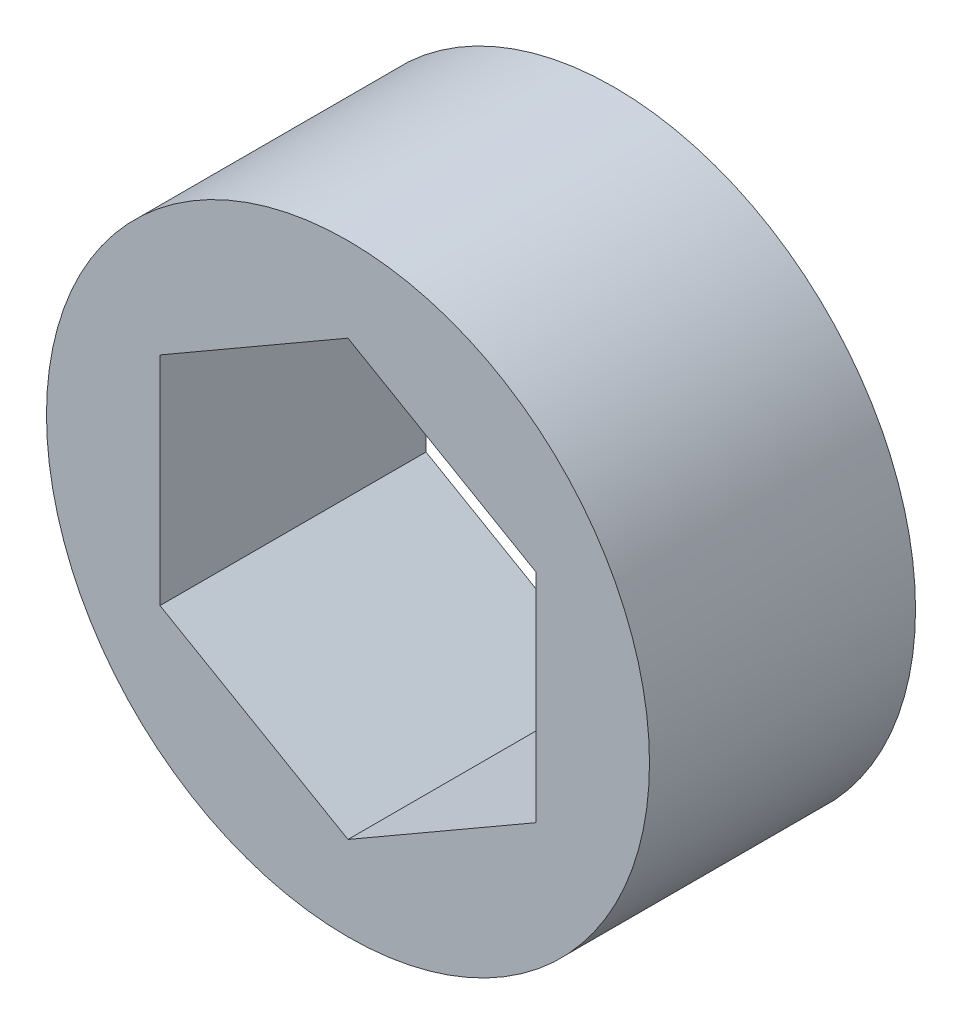
ISO-10303-21;
HEADER;
FILE_DESCRIPTION(('STEP AP214'),'2;1');
FILE_NAME('part.step','',(''),(''),'','','');
FILE_SCHEMA(('AUTOMOTIVE_DESIGN { 1 0 10303 214 1 1 1 1 }'));
ENDSEC;
DATA;
#1=APPLICATION_CONTEXT('core data for automotive mechanical design processes');
#2=APPLICATION_PROTOCOL_DEFINITION('international standard','automotive_design',2000,#1);
#3=PRODUCT_CONTEXT('',#1,'mechanical');
#4=PRODUCT('Part','Part','',(#3));
#5=PRODUCT_RELATED_PRODUCT_CATEGORY('part','',(#4));
#6=PRODUCT_DEFINITION_FORMATION('','',#4);
#7=PRODUCT_DEFINITION_CONTEXT('part definition',#1,'design');
#8=PRODUCT_DEFINITION('design','',#6,#7);
#9=PRODUCT_DEFINITION_SHAPE('','',#8);
#10=(LENGTH_UNIT() NAMED_UNIT(*) SI_UNIT(.MILLI.,.METRE.));
#11=(NAMED_UNIT(*) PLANE_ANGLE_UNIT() SI_UNIT($,.RADIAN.));
#12=(NAMED_UNIT(*) SI_UNIT($,.STERADIAN.) SOLID_ANGLE_UNIT());
#13=UNCERTAINTY_MEASURE_WITH_UNIT(LENGTH_MEASURE(1.E-05),#10,'distance_accuracy_value','');
#14=(GEOMETRIC_REPRESENTATION_CONTEXT(3) GLOBAL_UNCERTAINTY_ASSIGNED_CONTEXT((#13)) GLOBAL_UNIT_ASSIGNED_CONTEXT((#10,
#11,#12)) REPRESENTATION_CONTEXT('',''));
#15=CARTESIAN_POINT('',(0.,0.,0.));
#16=DIRECTION('',(0.,0.,1.));
#17=DIRECTION('',(1.,0.,0.));
#18=AXIS2_PLACEMENT_3D('',#15,#16,#17);
#19=CARTESIAN_POINT('',(0.,0.,9.525));
#20=DIRECTION('',(0.,0.,1.));
#21=DIRECTION('',(1.,0.,0.));
#22=AXIS2_PLACEMENT_3D('',#19,#20,#21);
#23=PLANE('',#22);
#24=CARTESIAN_POINT('',(0.,0.,9.525));
#25=DIRECTION('',(0.,0.,1.));
#26=DIRECTION('',(1.,0.,0.));
#27=AXIS2_PLACEMENT_3D('',#24,#25,#26);
#28=CIRCLE('',#27,10.795);
#29=CARTESIAN_POINT('',(10.795,0.,9.525));
#30=VERTEX_POINT('',#29);
#31=EDGE_CURVE('E11',#30,#30,#28,.T.);
#32=ORIENTED_EDGE('',*,*,#31,.T.);
#33=EDGE_LOOP('',(#32));
#34=FACE_BOUND('',#33,.T.);
#35=DIRECTION('',(-0.866025403784439,0.5,0.));
#36=VECTOR('',#35,1.);
#37=CARTESIAN_POINT('',(6.731,3.88614466191537,9.525));
#38=LINE('',#37,#36);
#39=CARTESIAN_POINT('',(6.731,3.88614466191537,9.525));
#40=VERTEX_POINT('',#39);
#41=CARTESIAN_POINT('',(0.,7.77228932383074,9.525));
#42=VERTEX_POINT('',#41);
#43=EDGE_CURVE('E99',#40,#42,#38,.T.);
#44=ORIENTED_EDGE('',*,*,#43,.F.);
#45=DIRECTION('',(0.,1.,0.));
#46=VECTOR('',#45,1.);
#47=CARTESIAN_POINT('',(6.731,-3.88614466191537,9.525));
#48=LINE('',#47,#46);
#49=CARTESIAN_POINT('',(6.731,-3.88614466191537,9.525));
#50=VERTEX_POINT('',#49);
#51=EDGE_CURVE('E91',#50,#40,#48,.T.);
#52=ORIENTED_EDGE('',*,*,#51,.F.);
#53=DIRECTION('',(0.866025403784439,0.5,0.));
#54=VECTOR('',#53,1.);
#55=CARTESIAN_POINT('',(0.,-7.77228932383074,9.525));
#56=LINE('',#55,#54);
#57=CARTESIAN_POINT('',(0.,-7.77228932383074,9.525));
#58=VERTEX_POINT('',#57);
#59=EDGE_CURVE('E119',#58,#50,#56,.T.);
#60=ORIENTED_EDGE('',*,*,#59,.F.);
#61=DIRECTION('',(0.866025403784439,-0.5,0.));
#62=VECTOR('',#61,1.);
#63=CARTESIAN_POINT('',(-6.731,-3.88614466191537,9.525));
#64=LINE('',#63,#62);
#65=CARTESIAN_POINT('',(-6.731,-3.88614466191537,9.525));
#66=VERTEX_POINT('',#65);
#67=EDGE_CURVE('E117',#66,#58,#64,.T.);
#68=ORIENTED_EDGE('',*,*,#67,.F.);
#69=DIRECTION('',(0.,-1.,0.));
#70=VECTOR('',#69,1.);
#71=CARTESIAN_POINT('',(-6.731,3.88614466191537,9.525));
#72=LINE('',#71,#70);
#73=CARTESIAN_POINT('',(-6.731,3.88614466191537,9.525));
#74=VERTEX_POINT('',#73);
#75=EDGE_CURVE('E113',#74,#66,#72,.T.);
#76=ORIENTED_EDGE('',*,*,#75,.F.);
#77=DIRECTION('',(-0.866025403784439,-0.5,0.));
#78=VECTOR('',#77,1.);
#79=CARTESIAN_POINT('',(0.,7.77228932383074,9.525));
#80=LINE('',#79,#78);
#81=EDGE_CURVE('E111',#42,#74,#80,.T.);
#82=ORIENTED_EDGE('',*,*,#81,.F.);
#83=EDGE_LOOP('',(#44,#52,#60,#68,#76,#82));
#84=FACE_BOUND('',#83,.T.);
#85=ADVANCED_FACE('F38',(#34,#84),#23,.T.);
#86=CARTESIAN_POINT('',(0.,0.,0.));
#87=DIRECTION('',(0.,0.,1.));
#88=DIRECTION('',(1.,0.,0.));
#89=AXIS2_PLACEMENT_3D('',#86,#87,#88);
#90=PLANE('',#89);
#91=CARTESIAN_POINT('',(0.,0.,0.));
#92=DIRECTION('',(0.,0.,1.));
#93=DIRECTION('',(1.,0.,0.));
#94=AXIS2_PLACEMENT_3D('',#91,#92,#93);
#95=CIRCLE('',#94,10.795);
#96=CARTESIAN_POINT('',(10.795,0.,0.));
#97=VERTEX_POINT('',#96);
#98=EDGE_CURVE('E42',#97,#97,#95,.T.);
#99=ORIENTED_EDGE('',*,*,#98,.F.);
#100=EDGE_LOOP('',(#99));
#101=FACE_BOUND('',#100,.T.);
#102=DIRECTION('',(0.,1.,0.));
#103=VECTOR('',#102,1.);
#104=CARTESIAN_POINT('',(6.731,-3.88614466191537,0.));
#105=LINE('',#104,#103);
#106=CARTESIAN_POINT('',(6.731,-3.88614466191537,0.));
#107=VERTEX_POINT('',#106);
#108=CARTESIAN_POINT('',(6.731,3.88614466191537,0.));
#109=VERTEX_POINT('',#108);
#110=EDGE_CURVE('E61',#107,#109,#105,.T.);
#111=ORIENTED_EDGE('',*,*,#110,.T.);
#112=DIRECTION('',(-0.866025403784439,0.5,0.));
#113=VECTOR('',#112,1.);
#114=CARTESIAN_POINT('',(6.731,3.88614466191537,0.));
#115=LINE('',#114,#113);
#116=CARTESIAN_POINT('',(0.,7.77228932383074,0.));
#117=VERTEX_POINT('',#116);
#118=EDGE_CURVE('E106',#109,#117,#115,.T.);
#119=ORIENTED_EDGE('',*,*,#118,.T.);
#120=DIRECTION('',(-0.866025403784439,-0.5,0.));
#121=VECTOR('',#120,1.);
#122=CARTESIAN_POINT('',(0.,7.77228932383074,0.));
#123=LINE('',#122,#121);
#124=CARTESIAN_POINT('',(-6.731,3.88614466191537,0.));
#125=VERTEX_POINT('',#124);
#126=EDGE_CURVE('E123',#117,#125,#123,.T.);
#127=ORIENTED_EDGE('',*,*,#126,.T.);
#128=DIRECTION('',(0.,-1.,0.));
#129=VECTOR('',#128,1.);
#130=CARTESIAN_POINT('',(-6.731,3.88614466191537,0.));
#131=LINE('',#130,#129);
#132=CARTESIAN_POINT('',(-6.731,-3.88614466191537,0.));
#133=VERTEX_POINT('',#132);
#134=EDGE_CURVE('E126',#125,#133,#131,.T.);
#135=ORIENTED_EDGE('',*,*,#134,.T.);
#136=DIRECTION('',(0.866025403784439,-0.5,0.));
#137=VECTOR('',#136,1.);
#138=CARTESIAN_POINT('',(-6.731,-3.88614466191537,0.));
#139=LINE('',#138,#137);
#140=CARTESIAN_POINT('',(0.,-7.77228932383074,0.));
#141=VERTEX_POINT('',#140);
#142=EDGE_CURVE('E129',#133,#141,#139,.T.);
#143=ORIENTED_EDGE('',*,*,#142,.T.);
#144=DIRECTION('',(0.866025403784439,0.5,0.));
#145=VECTOR('',#144,1.);
#146=CARTESIAN_POINT('',(0.,-7.77228932383074,0.));
#147=LINE('',#146,#145);
#148=EDGE_CURVE('E100',#141,#107,#147,.T.);
#149=ORIENTED_EDGE('',*,*,#148,.T.);
#150=EDGE_LOOP('',(#111,#119,#127,#135,#143,#149));
#151=FACE_BOUND('',#150,.T.);
#152=ADVANCED_FACE('F146',(#101,#151),#90,.F.);
#153=CARTESIAN_POINT('',(0.,0.,9.525));
#154=DIRECTION('',(0.,0.,-1.));
#155=DIRECTION('',(-1.,0.,0.));
#156=AXIS2_PLACEMENT_3D('',#153,#154,#155);
#157=CYLINDRICAL_SURFACE('',#156,10.795);
#158=ORIENTED_EDGE('',*,*,#31,.F.);
#159=EDGE_LOOP('',(#158));
#160=FACE_BOUND('',#159,.T.);
#161=ORIENTED_EDGE('',*,*,#98,.T.);
#162=EDGE_LOOP('',(#161));
#163=FACE_BOUND('',#162,.T.);
#164=ADVANCED_FACE('F40',(#160,#163),#157,.T.);
#165=CARTESIAN_POINT('',(6.731,-3.88614466191537,9.525));
#166=DIRECTION('',(-1.,0.,0.));
#167=DIRECTION('',(0.,-1.,0.));
#168=AXIS2_PLACEMENT_3D('',#165,#166,#167);
#169=PLANE('',#168);
#170=ORIENTED_EDGE('',*,*,#110,.F.);
#171=DIRECTION('',(0.,0.,-1.));
#172=VECTOR('',#171,1.);
#173=CARTESIAN_POINT('',(6.731,-3.88614466191537,9.525));
#174=LINE('',#173,#172);
#175=EDGE_CURVE('E95',#50,#107,#174,.T.);
#176=ORIENTED_EDGE('',*,*,#175,.F.);
#177=ORIENTED_EDGE('',*,*,#51,.T.);
#178=DIRECTION('',(0.,0.,-1.));
#179=VECTOR('',#178,1.);
#180=CARTESIAN_POINT('',(6.731,3.88614466191537,9.525));
#181=LINE('',#180,#179);
#182=EDGE_CURVE('E94',#40,#109,#181,.T.);
#183=ORIENTED_EDGE('',*,*,#182,.T.);
#184=EDGE_LOOP('',(#170,#176,#177,#183));
#185=FACE_BOUND('',#184,.T.);
#186=ADVANCED_FACE('F93',(#185),#169,.T.);
#187=CARTESIAN_POINT('',(6.731,3.88614466191537,9.525));
#188=DIRECTION('',(-0.5,-0.866025403784439,0.));
#189=DIRECTION('',(0.866025403784439,-0.5,0.));
#190=AXIS2_PLACEMENT_3D('',#187,#188,#189);
#191=PLANE('',#190);
#192=ORIENTED_EDGE('',*,*,#118,.F.);
#193=ORIENTED_EDGE('',*,*,#182,.F.);
#194=ORIENTED_EDGE('',*,*,#43,.T.);
#195=DIRECTION('',(0.,0.,-1.));
#196=VECTOR('',#195,1.);
#197=CARTESIAN_POINT('',(0.,7.77228932383074,9.525));
#198=LINE('',#197,#196);
#199=EDGE_CURVE('E107',#42,#117,#198,.T.);
#200=ORIENTED_EDGE('',*,*,#199,.T.);
#201=EDGE_LOOP('',(#192,#193,#194,#200));
#202=FACE_BOUND('',#201,.T.);
#203=ADVANCED_FACE('F103',(#202),#191,.T.);
#204=CARTESIAN_POINT('',(0.,7.77228932383074,9.525));
#205=DIRECTION('',(0.5,-0.866025403784439,0.));
#206=DIRECTION('',(0.866025403784439,0.5,0.));
#207=AXIS2_PLACEMENT_3D('',#204,#205,#206);
#208=PLANE('',#207);
#209=ORIENTED_EDGE('',*,*,#126,.F.);
#210=ORIENTED_EDGE('',*,*,#199,.F.);
#211=ORIENTED_EDGE('',*,*,#81,.T.);
#212=DIRECTION('',(0.,0.,-1.));
#213=VECTOR('',#212,1.);
#214=CARTESIAN_POINT('',(-6.731,3.88614466191537,9.525));
#215=LINE('',#214,#213);
#216=EDGE_CURVE('E138',#74,#125,#215,.T.);
#217=ORIENTED_EDGE('',*,*,#216,.T.);
#218=EDGE_LOOP('',(#209,#210,#211,#217));
#219=FACE_BOUND('',#218,.T.);
#220=ADVANCED_FACE('F142',(#219),#208,.T.);
#221=CARTESIAN_POINT('',(-6.731,3.88614466191537,9.525));
#222=DIRECTION('',(1.,0.,0.));
#223=DIRECTION('',(0.,1.,0.));
#224=AXIS2_PLACEMENT_3D('',#221,#222,#223);
#225=PLANE('',#224);
#226=ORIENTED_EDGE('',*,*,#134,.F.);
#227=ORIENTED_EDGE('',*,*,#216,.F.);
#228=ORIENTED_EDGE('',*,*,#75,.T.);
#229=DIRECTION('',(0.,0.,-1.));
#230=VECTOR('',#229,1.);
#231=CARTESIAN_POINT('',(-6.731,-3.88614466191537,9.525));
#232=LINE('',#231,#230);
#233=EDGE_CURVE('E136',#66,#133,#232,.T.);
#234=ORIENTED_EDGE('',*,*,#233,.T.);
#235=EDGE_LOOP('',(#226,#227,#228,#234));
#236=FACE_BOUND('',#235,.T.);
#237=ADVANCED_FACE('F154',(#236),#225,.T.);
#238=CARTESIAN_POINT('',(-6.731,-3.88614466191537,9.525));
#239=DIRECTION('',(0.5,0.866025403784439,0.));
#240=DIRECTION('',(-0.866025403784439,0.5,0.));
#241=AXIS2_PLACEMENT_3D('',#238,#239,#240);
#242=PLANE('',#241);
#243=ORIENTED_EDGE('',*,*,#142,.F.);
#244=ORIENTED_EDGE('',*,*,#233,.F.);
#245=ORIENTED_EDGE('',*,*,#67,.T.);
#246=DIRECTION('',(0.,0.,-1.));
#247=VECTOR('',#246,1.);
#248=CARTESIAN_POINT('',(0.,-7.77228932383074,9.525));
#249=LINE('',#248,#247);
#250=EDGE_CURVE('E53',#58,#141,#249,.T.);
#251=ORIENTED_EDGE('',*,*,#250,.T.);
#252=EDGE_LOOP('',(#243,#244,#245,#251));
#253=FACE_BOUND('',#252,.T.);
#254=ADVANCED_FACE('F152',(#253),#242,.T.);
#255=CARTESIAN_POINT('',(0.,-7.77228932383074,9.525));
#256=DIRECTION('',(-0.5,0.866025403784439,0.));
#257=DIRECTION('',(-0.866025403784439,-0.5,0.));
#258=AXIS2_PLACEMENT_3D('',#255,#256,#257);
#259=PLANE('',#258);
#260=ORIENTED_EDGE('',*,*,#148,.F.);
#261=ORIENTED_EDGE('',*,*,#250,.F.);
#262=ORIENTED_EDGE('',*,*,#59,.T.);
#263=ORIENTED_EDGE('',*,*,#175,.T.);
#264=EDGE_LOOP('',(#260,#261,#262,#263));
#265=FACE_BOUND('',#264,.T.);
#266=ADVANCED_FACE('F148',(#265),#259,.T.);
#267=CLOSED_SHELL('',(#85,#152,#164,#186,#203,#220,#237,#254,#266));
#268=MANIFOLD_SOLID_BREP('B2',#267);
#269=ADVANCED_BREP_SHAPE_REPRESENTATION('',(#18,#268),#14);
#270=SHAPE_DEFINITION_REPRESENTATION(#9,#269);
ENDSEC;
END-ISO-10303-21;
